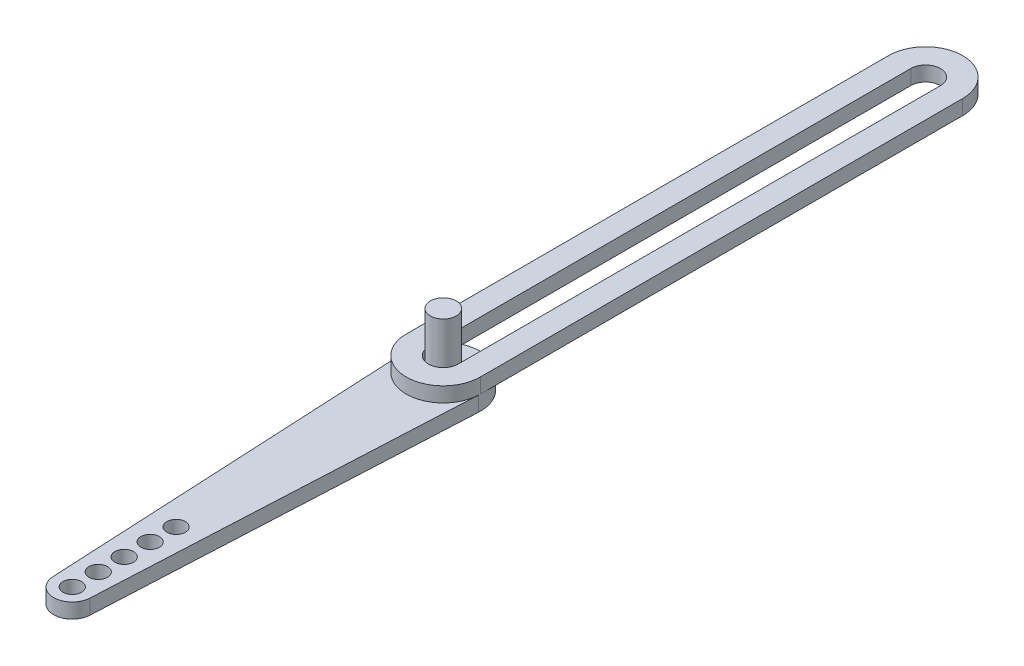
ISO-10303-21;
HEADER;
FILE_DESCRIPTION(('STEP AP214'),'2;1');
FILE_NAME('part.step','',(''),(''),'','','');
FILE_SCHEMA(('AUTOMOTIVE_DESIGN { 1 0 10303 214 1 1 1 1 }'));
ENDSEC;
DATA;
#1=APPLICATION_CONTEXT('core data for automotive mechanical design processes');
#2=APPLICATION_PROTOCOL_DEFINITION('international standard','automotive_design',2000,#1);
#3=PRODUCT_CONTEXT('',#1,'mechanical');
#4=PRODUCT('Part','Part','',(#3));
#5=PRODUCT_RELATED_PRODUCT_CATEGORY('part','',(#4));
#6=PRODUCT_DEFINITION_FORMATION('','',#4);
#7=PRODUCT_DEFINITION_CONTEXT('part definition',#1,'design');
#8=PRODUCT_DEFINITION('design','',#6,#7);
#9=PRODUCT_DEFINITION_SHAPE('','',#8);
#10=(LENGTH_UNIT() NAMED_UNIT(*) SI_UNIT(.MILLI.,.METRE.));
#11=(NAMED_UNIT(*) PLANE_ANGLE_UNIT() SI_UNIT($,.RADIAN.));
#12=(NAMED_UNIT(*) SI_UNIT($,.STERADIAN.) SOLID_ANGLE_UNIT());
#13=UNCERTAINTY_MEASURE_WITH_UNIT(LENGTH_MEASURE(1.E-05),#10,'distance_accuracy_value','');
#14=(GEOMETRIC_REPRESENTATION_CONTEXT(3) GLOBAL_UNCERTAINTY_ASSIGNED_CONTEXT((#13)) GLOBAL_UNIT_ASSIGNED_CONTEXT((#10,
#11,#12)) REPRESENTATION_CONTEXT('',''));
#15=CARTESIAN_POINT('',(0.,0.,0.));
#16=DIRECTION('',(0.,0.,1.));
#17=DIRECTION('',(1.,0.,0.));
#18=AXIS2_PLACEMENT_3D('',#15,#16,#17);
#19=CARTESIAN_POINT('',(0.,-15.,0.));
#20=DIRECTION('',(0.,-1.,0.));
#21=DIRECTION('',(0.,0.,-1.));
#22=AXIS2_PLACEMENT_3D('',#19,#20,#21);
#23=PLANE('',#22);
#24=CARTESIAN_POINT('',(0.,-15.,72.));
#25=DIRECTION('',(0.,-1.,0.));
#26=DIRECTION('',(0.,0.,-1.));
#27=AXIS2_PLACEMENT_3D('',#24,#25,#26);
#28=CIRCLE('',#27,2.5);
#29=CARTESIAN_POINT('',(0.,-15.,69.5));
#30=VERTEX_POINT('',#29);
#31=EDGE_CURVE('E214',#30,#30,#28,.T.);
#32=ORIENTED_EDGE('',*,*,#31,.T.);
#33=EDGE_LOOP('',(#32));
#34=FACE_BOUND('',#33,.T.);
#35=CARTESIAN_POINT('',(0.,-15.,79.));
#36=DIRECTION('',(0.,-1.,0.));
#37=DIRECTION('',(0.,0.,-1.));
#38=AXIS2_PLACEMENT_3D('',#35,#36,#37);
#39=CIRCLE('',#38,2.5);
#40=CARTESIAN_POINT('',(0.,-15.,76.5));
#41=VERTEX_POINT('',#40);
#42=EDGE_CURVE('E218',#41,#41,#39,.T.);
#43=ORIENTED_EDGE('',*,*,#42,.T.);
#44=EDGE_LOOP('',(#43));
#45=FACE_BOUND('',#44,.T.);
#46=CARTESIAN_POINT('',(0.,-15.,86.));
#47=DIRECTION('',(0.,-1.,0.));
#48=DIRECTION('',(0.,0.,-1.));
#49=AXIS2_PLACEMENT_3D('',#46,#47,#48);
#50=CIRCLE('',#49,2.5);
#51=CARTESIAN_POINT('',(0.,-15.,83.5));
#52=VERTEX_POINT('',#51);
#53=EDGE_CURVE('E222',#52,#52,#50,.T.);
#54=ORIENTED_EDGE('',*,*,#53,.T.);
#55=EDGE_LOOP('',(#54));
#56=FACE_BOUND('',#55,.T.);
#57=CARTESIAN_POINT('',(0.,-15.,93.));
#58=DIRECTION('',(0.,-1.,0.));
#59=DIRECTION('',(0.,0.,-1.));
#60=AXIS2_PLACEMENT_3D('',#57,#58,#59);
#61=CIRCLE('',#60,2.5);
#62=CARTESIAN_POINT('',(0.,-15.,90.5));
#63=VERTEX_POINT('',#62);
#64=EDGE_CURVE('E226',#63,#63,#61,.T.);
#65=ORIENTED_EDGE('',*,*,#64,.T.);
#66=EDGE_LOOP('',(#65));
#67=FACE_BOUND('',#66,.T.);
#68=CARTESIAN_POINT('',(0.,-15.,100.));
#69=DIRECTION('',(0.,-1.,0.));
#70=DIRECTION('',(0.,0.,-1.));
#71=AXIS2_PLACEMENT_3D('',#68,#69,#70);
#72=CIRCLE('',#71,2.5);
#73=CARTESIAN_POINT('',(0.,-15.,97.5));
#74=VERTEX_POINT('',#73);
#75=EDGE_CURVE('E230',#74,#74,#72,.T.);
#76=ORIENTED_EDGE('',*,*,#75,.T.);
#77=EDGE_LOOP('',(#76));
#78=FACE_BOUND('',#77,.T.);
#79=CARTESIAN_POINT('',(0.,-15.,0.));
#80=DIRECTION('',(0.,-1.,0.));
#81=DIRECTION('',(0.,0.,-1.));
#82=AXIS2_PLACEMENT_3D('',#79,#80,#81);
#83=CIRCLE('',#82,10.);
#84=CARTESIAN_POINT('',(-9.98749217771909,-15.,0.5));
#85=VERTEX_POINT('',#84);
#86=CARTESIAN_POINT('',(9.98749217771909,-15.,0.5));
#87=VERTEX_POINT('',#86);
#88=EDGE_CURVE('E11',#85,#87,#83,.F.);
#89=ORIENTED_EDGE('',*,*,#88,.F.);
#90=DIRECTION('',(-0.05,0.,-0.998749217771909));
#91=VECTOR('',#90,1.);
#92=CARTESIAN_POINT('',(-9.98749217771909,-15.,0.5));
#93=LINE('',#92,#91);
#94=CARTESIAN_POINT('',(-4.99374608885955,-15.,100.25));
#95=VERTEX_POINT('',#94);
#96=EDGE_CURVE('E233',#95,#85,#93,.T.);
#97=ORIENTED_EDGE('',*,*,#96,.F.);
#98=CARTESIAN_POINT('',(0.,-15.,100.));
#99=DIRECTION('',(0.,-1.,0.));
#100=DIRECTION('',(0.,0.,-1.));
#101=AXIS2_PLACEMENT_3D('',#98,#99,#100);
#102=CIRCLE('',#101,5.);
#103=CARTESIAN_POINT('',(4.99374608885955,-15.,100.25));
#104=VERTEX_POINT('',#103);
#105=EDGE_CURVE('E74',#104,#95,#102,.T.);
#106=ORIENTED_EDGE('',*,*,#105,.F.);
#107=DIRECTION('',(-0.05,0.,0.998749217771909));
#108=VECTOR('',#107,1.);
#109=CARTESIAN_POINT('',(9.98749217771909,-15.,0.5));
#110=LINE('',#109,#108);
#111=EDGE_CURVE('E244',#87,#104,#110,.T.);
#112=ORIENTED_EDGE('',*,*,#111,.F.);
#113=EDGE_LOOP('',(#89,#97,#106,#112));
#114=FACE_BOUND('',#113,.T.);
#115=ADVANCED_FACE('F34',(#34,#45,#56,#67,#78,#114),#23,.F.);
#116=CARTESIAN_POINT('',(0.,-15.,0.));
#117=DIRECTION('',(0.,1.,0.));
#118=DIRECTION('',(0.,0.,1.));
#119=AXIS2_PLACEMENT_3D('',#116,#117,#118);
#120=CYLINDRICAL_SURFACE('',#119,3.5);
#121=CARTESIAN_POINT('',(0.,-15.,0.));
#122=DIRECTION('',(0.,-1.,0.));
#123=DIRECTION('',(0.,0.,-1.));
#124=AXIS2_PLACEMENT_3D('',#121,#122,#123);
#125=CIRCLE('',#124,3.5);
#126=CARTESIAN_POINT('',(0.,-15.,-3.5));
#127=VERTEX_POINT('',#126);
#128=EDGE_CURVE('E257',#127,#127,#125,.F.);
#129=ORIENTED_EDGE('',*,*,#128,.T.);
#130=EDGE_LOOP('',(#129));
#131=FACE_BOUND('',#130,.T.);
#132=CARTESIAN_POINT('',(0.,0.,0.));
#133=DIRECTION('',(0.,1.,0.));
#134=DIRECTION('',(0.,0.,1.));
#135=AXIS2_PLACEMENT_3D('',#132,#133,#134);
#136=CIRCLE('',#135,3.5);
#137=CARTESIAN_POINT('',(0.,0.,3.5));
#138=VERTEX_POINT('',#137);
#139=EDGE_CURVE('E260',#138,#138,#136,.T.);
#140=ORIENTED_EDGE('',*,*,#139,.F.);
#141=EDGE_LOOP('',(#140));
#142=FACE_BOUND('',#141,.T.);
#143=ADVANCED_FACE('F36',(#131,#142),#120,.T.);
#144=CARTESIAN_POINT('',(0.,0.,0.));
#145=DIRECTION('',(0.,1.,0.));
#146=DIRECTION('',(0.,0.,1.));
#147=AXIS2_PLACEMENT_3D('',#144,#145,#146);
#148=PLANE('',#147);
#149=ORIENTED_EDGE('',*,*,#139,.T.);
#150=EDGE_LOOP('',(#149));
#151=FACE_BOUND('',#150,.T.);
#152=ADVANCED_FACE('F320',(#151),#148,.T.);
#153=CARTESIAN_POINT('',(0.,-19.,0.));
#154=DIRECTION('',(0.,1.,0.));
#155=DIRECTION('',(0.,0.,1.));
#156=AXIS2_PLACEMENT_3D('',#153,#154,#155);
#157=CYLINDRICAL_SURFACE('',#156,10.);
#158=DIRECTION('',(0.,-1.,0.));
#159=VECTOR('',#158,1.);
#160=CARTESIAN_POINT('',(-10.,-11.,0.));
#161=LINE('',#160,#159);
#162=CARTESIAN_POINT('',(-10.,-11.,0.));
#163=VERTEX_POINT('',#162);
#164=CARTESIAN_POINT('',(-10.,-15.,0.));
#165=VERTEX_POINT('',#164);
#166=EDGE_CURVE('E194',#163,#165,#161,.T.);
#167=ORIENTED_EDGE('',*,*,#166,.T.);
#168=CARTESIAN_POINT('',(0.,-15.,0.));
#169=DIRECTION('',(0.,-1.,0.));
#170=DIRECTION('',(0.,0.,-1.));
#171=AXIS2_PLACEMENT_3D('',#168,#169,#170);
#172=CIRCLE('',#171,10.);
#173=CARTESIAN_POINT('',(-4.,-15.,-9.16515138991168));
#174=VERTEX_POINT('',#173);
#175=EDGE_CURVE('E243',#165,#174,#172,.T.);
#176=ORIENTED_EDGE('',*,*,#175,.T.);
#177=CARTESIAN_POINT('',(4.,-15.,-9.16515138991168));
#178=VERTEX_POINT('',#177);
#179=EDGE_CURVE('E242',#174,#178,#172,.T.);
#180=ORIENTED_EDGE('',*,*,#179,.T.);
#181=CARTESIAN_POINT('',(10.,-15.,0.));
#182=VERTEX_POINT('',#181);
#183=EDGE_CURVE('E239',#178,#182,#172,.T.);
#184=ORIENTED_EDGE('',*,*,#183,.T.);
#185=DIRECTION('',(0.,-1.,0.));
#186=VECTOR('',#185,1.);
#187=CARTESIAN_POINT('',(10.,-11.,0.));
#188=LINE('',#187,#186);
#189=CARTESIAN_POINT('',(10.,-11.,0.));
#190=VERTEX_POINT('',#189);
#191=EDGE_CURVE('E208',#190,#182,#188,.T.);
#192=ORIENTED_EDGE('',*,*,#191,.F.);
#193=CARTESIAN_POINT('',(0.,-11.,0.));
#194=DIRECTION('',(0.,1.,0.));
#195=DIRECTION('',(0.,0.,1.));
#196=AXIS2_PLACEMENT_3D('',#193,#194,#195);
#197=CIRCLE('',#196,10.);
#198=EDGE_CURVE('E184',#163,#190,#197,.T.);
#199=ORIENTED_EDGE('',*,*,#198,.F.);
#200=EDGE_LOOP('',(#167,#176,#180,#184,#192,#199));
#201=FACE_BOUND('',#200,.T.);
#202=DIRECTION('',(0.,1.,0.));
#203=VECTOR('',#202,1.);
#204=CARTESIAN_POINT('',(-9.98749217771909,-19.,0.5));
#205=LINE('',#204,#203);
#206=CARTESIAN_POINT('',(-9.98749217771909,-19.,0.5));
#207=VERTEX_POINT('',#206);
#208=EDGE_CURVE('E238',#207,#85,#205,.T.);
#209=ORIENTED_EDGE('',*,*,#208,.T.);
#210=ORIENTED_EDGE('',*,*,#88,.T.);
#211=DIRECTION('',(0.,1.,0.));
#212=VECTOR('',#211,1.);
#213=CARTESIAN_POINT('',(9.98749217771909,-19.,0.5));
#214=LINE('',#213,#212);
#215=CARTESIAN_POINT('',(9.98749217771909,-19.,0.5));
#216=VERTEX_POINT('',#215);
#217=EDGE_CURVE('E255',#216,#87,#214,.T.);
#218=ORIENTED_EDGE('',*,*,#217,.F.);
#219=CARTESIAN_POINT('',(0.,-19.,0.));
#220=DIRECTION('',(0.,-1.,0.));
#221=DIRECTION('',(0.,0.,-1.));
#222=AXIS2_PLACEMENT_3D('',#219,#220,#221);
#223=CIRCLE('',#222,10.);
#224=EDGE_CURVE('E231',#207,#216,#223,.T.);
#225=ORIENTED_EDGE('',*,*,#224,.F.);
#226=EDGE_LOOP('',(#209,#210,#218,#225));
#227=FACE_BOUND('',#226,.T.);
#228=ADVANCED_FACE('F287',(#201,#227),#157,.T.);
#229=CARTESIAN_POINT('',(9.98749217771909,-19.,0.5));
#230=DIRECTION('',(-0.998749217771909,0.,-0.05));
#231=DIRECTION('',(-0.05,0.,0.998749217771909));
#232=AXIS2_PLACEMENT_3D('',#229,#230,#231);
#233=PLANE('',#232);
#234=ORIENTED_EDGE('',*,*,#111,.T.);
#235=DIRECTION('',(0.,1.,0.));
#236=VECTOR('',#235,1.);
#237=CARTESIAN_POINT('',(4.99374608885955,-19.,100.25));
#238=LINE('',#237,#236);
#239=CARTESIAN_POINT('',(4.99374608885955,-19.,100.25));
#240=VERTEX_POINT('',#239);
#241=EDGE_CURVE('E253',#240,#104,#238,.T.);
#242=ORIENTED_EDGE('',*,*,#241,.F.);
#243=DIRECTION('',(-0.05,0.,0.998749217771909));
#244=VECTOR('',#243,1.);
#245=CARTESIAN_POINT('',(9.98749217771909,-19.,0.5));
#246=LINE('',#245,#244);
#247=EDGE_CURVE('E82',#216,#240,#246,.T.);
#248=ORIENTED_EDGE('',*,*,#247,.F.);
#249=ORIENTED_EDGE('',*,*,#217,.T.);
#250=EDGE_LOOP('',(#234,#242,#248,#249));
#251=FACE_BOUND('',#250,.T.);
#252=ADVANCED_FACE('F346',(#251),#233,.F.);
#253=CARTESIAN_POINT('',(0.,-19.,100.));
#254=DIRECTION('',(0.,1.,0.));
#255=DIRECTION('',(0.,0.,1.));
#256=AXIS2_PLACEMENT_3D('',#253,#254,#255);
#257=CYLINDRICAL_SURFACE('',#256,5.);
#258=ORIENTED_EDGE('',*,*,#105,.T.);
#259=DIRECTION('',(0.,1.,0.));
#260=VECTOR('',#259,1.);
#261=CARTESIAN_POINT('',(-4.99374608885955,-19.,100.25));
#262=LINE('',#261,#260);
#263=CARTESIAN_POINT('',(-4.99374608885955,-19.,100.25));
#264=VERTEX_POINT('',#263);
#265=EDGE_CURVE('E251',#264,#95,#262,.T.);
#266=ORIENTED_EDGE('',*,*,#265,.F.);
#267=CARTESIAN_POINT('',(0.,-19.,100.));
#268=DIRECTION('',(0.,-1.,0.));
#269=DIRECTION('',(0.,0.,-1.));
#270=AXIS2_PLACEMENT_3D('',#267,#268,#269);
#271=CIRCLE('',#270,5.);
#272=EDGE_CURVE('E235',#240,#264,#271,.T.);
#273=ORIENTED_EDGE('',*,*,#272,.F.);
#274=ORIENTED_EDGE('',*,*,#241,.T.);
#275=EDGE_LOOP('',(#258,#266,#273,#274));
#276=FACE_BOUND('',#275,.T.);
#277=ADVANCED_FACE('F351',(#276),#257,.T.);
#278=CARTESIAN_POINT('',(-9.98749217771909,-19.,0.5));
#279=DIRECTION('',(0.998749217771909,0.,-0.05));
#280=DIRECTION('',(-0.05,0.,-0.998749217771909));
#281=AXIS2_PLACEMENT_3D('',#278,#279,#280);
#282=PLANE('',#281);
#283=ORIENTED_EDGE('',*,*,#96,.T.);
#284=ORIENTED_EDGE('',*,*,#208,.F.);
#285=DIRECTION('',(-0.05,0.,-0.998749217771909));
#286=VECTOR('',#285,1.);
#287=CARTESIAN_POINT('',(-9.98749217771909,-19.,0.5));
#288=LINE('',#287,#286);
#289=EDGE_CURVE('E58',#264,#207,#288,.T.);
#290=ORIENTED_EDGE('',*,*,#289,.F.);
#291=ORIENTED_EDGE('',*,*,#265,.T.);
#292=EDGE_LOOP('',(#283,#284,#290,#291));
#293=FACE_BOUND('',#292,.T.);
#294=ADVANCED_FACE('F336',(#293),#282,.F.);
#295=CARTESIAN_POINT('',(0.,-19.,0.));
#296=DIRECTION('',(0.,-1.,0.));
#297=DIRECTION('',(0.,0.,-1.));
#298=AXIS2_PLACEMENT_3D('',#295,#296,#297);
#299=PLANE('',#298);
#300=CARTESIAN_POINT('',(0.,-19.,0.));
#301=DIRECTION('',(0.,-1.,0.));
#302=DIRECTION('',(0.,0.,-1.));
#303=AXIS2_PLACEMENT_3D('',#300,#301,#302);
#304=CIRCLE('',#303,6.5);
#305=CARTESIAN_POINT('',(0.,-19.,-6.5));
#306=VERTEX_POINT('',#305);
#307=EDGE_CURVE('E584',#306,#306,#304,.T.);
#308=ORIENTED_EDGE('',*,*,#307,.F.);
#309=EDGE_LOOP('',(#308));
#310=FACE_BOUND('',#309,.T.);
#311=CARTESIAN_POINT('',(0.,-19.,72.));
#312=DIRECTION('',(0.,-1.,0.));
#313=DIRECTION('',(0.,0.,-1.));
#314=AXIS2_PLACEMENT_3D('',#311,#312,#313);
#315=CIRCLE('',#314,2.5);
#316=CARTESIAN_POINT('',(0.,-19.,69.5));
#317=VERTEX_POINT('',#316);
#318=EDGE_CURVE('E211',#317,#317,#315,.T.);
#319=ORIENTED_EDGE('',*,*,#318,.F.);
#320=EDGE_LOOP('',(#319));
#321=FACE_BOUND('',#320,.T.);
#322=CARTESIAN_POINT('',(0.,-19.,79.));
#323=DIRECTION('',(0.,-1.,0.));
#324=DIRECTION('',(0.,0.,-1.));
#325=AXIS2_PLACEMENT_3D('',#322,#323,#324);
#326=CIRCLE('',#325,2.5);
#327=CARTESIAN_POINT('',(0.,-19.,76.5));
#328=VERTEX_POINT('',#327);
#329=EDGE_CURVE('E215',#328,#328,#326,.T.);
#330=ORIENTED_EDGE('',*,*,#329,.F.);
#331=EDGE_LOOP('',(#330));
#332=FACE_BOUND('',#331,.T.);
#333=CARTESIAN_POINT('',(0.,-19.,86.));
#334=DIRECTION('',(0.,-1.,0.));
#335=DIRECTION('',(0.,0.,-1.));
#336=AXIS2_PLACEMENT_3D('',#333,#334,#335);
#337=CIRCLE('',#336,2.5);
#338=CARTESIAN_POINT('',(0.,-19.,83.5));
#339=VERTEX_POINT('',#338);
#340=EDGE_CURVE('E219',#339,#339,#337,.T.);
#341=ORIENTED_EDGE('',*,*,#340,.F.);
#342=EDGE_LOOP('',(#341));
#343=FACE_BOUND('',#342,.T.);
#344=CARTESIAN_POINT('',(0.,-19.,93.));
#345=DIRECTION('',(0.,-1.,0.));
#346=DIRECTION('',(0.,0.,-1.));
#347=AXIS2_PLACEMENT_3D('',#344,#345,#346);
#348=CIRCLE('',#347,2.5);
#349=CARTESIAN_POINT('',(0.,-19.,90.5));
#350=VERTEX_POINT('',#349);
#351=EDGE_CURVE('E223',#350,#350,#348,.T.);
#352=ORIENTED_EDGE('',*,*,#351,.F.);
#353=EDGE_LOOP('',(#352));
#354=FACE_BOUND('',#353,.T.);
#355=CARTESIAN_POINT('',(0.,-19.,100.));
#356=DIRECTION('',(0.,-1.,0.));
#357=DIRECTION('',(0.,0.,-1.));
#358=AXIS2_PLACEMENT_3D('',#355,#356,#357);
#359=CIRCLE('',#358,2.5);
#360=CARTESIAN_POINT('',(0.,-19.,97.5));
#361=VERTEX_POINT('',#360);
#362=EDGE_CURVE('E227',#361,#361,#359,.T.);
#363=ORIENTED_EDGE('',*,*,#362,.F.);
#364=EDGE_LOOP('',(#363));
#365=FACE_BOUND('',#364,.T.);
#366=ORIENTED_EDGE('',*,*,#224,.T.);
#367=ORIENTED_EDGE('',*,*,#247,.T.);
#368=ORIENTED_EDGE('',*,*,#272,.T.);
#369=ORIENTED_EDGE('',*,*,#289,.T.);
#370=EDGE_LOOP('',(#366,#367,#368,#369));
#371=FACE_BOUND('',#370,.T.);
#372=ADVANCED_FACE('F327',(#310,#321,#332,#343,#354,#365,#371),#299,.T.);
#373=ORIENTED_EDGE('',*,*,#128,.F.);
#374=EDGE_LOOP('',(#373));
#375=FACE_BOUND('',#374,.T.);
#376=CARTESIAN_POINT('',(0.,-15.,0.));
#377=DIRECTION('',(0.,1.,0.));
#378=DIRECTION('',(0.,0.,1.));
#379=AXIS2_PLACEMENT_3D('',#376,#377,#378);
#380=CIRCLE('',#379,4.);
#381=CARTESIAN_POINT('',(-4.,-15.,0.));
#382=VERTEX_POINT('',#381);
#383=CARTESIAN_POINT('',(4.,-15.,0.));
#384=VERTEX_POINT('',#383);
#385=EDGE_CURVE('E170',#382,#384,#380,.T.);
#386=ORIENTED_EDGE('',*,*,#385,.T.);
#387=DIRECTION('',(0.,0.,-1.));
#388=VECTOR('',#387,1.);
#389=CARTESIAN_POINT('',(4.,-15.,0.));
#390=LINE('',#389,#388);
#391=EDGE_CURVE('E156',#384,#178,#390,.T.);
#392=ORIENTED_EDGE('',*,*,#391,.T.);
#393=ORIENTED_EDGE('',*,*,#179,.F.);
#394=DIRECTION('',(0.,0.,1.));
#395=VECTOR('',#394,1.);
#396=CARTESIAN_POINT('',(-4.,-15.,0.));
#397=LINE('',#396,#395);
#398=EDGE_CURVE('E42',#174,#382,#397,.T.);
#399=ORIENTED_EDGE('',*,*,#398,.T.);
#400=EDGE_LOOP('',(#386,#392,#393,#399));
#401=FACE_BOUND('',#400,.T.);
#402=ADVANCED_FACE('F275',(#375,#401),#23,.F.);
#403=CARTESIAN_POINT('',(0.,0.,100.));
#404=DIRECTION('',(0.,-1.,0.));
#405=DIRECTION('',(0.,0.,-1.));
#406=AXIS2_PLACEMENT_3D('',#403,#404,#405);
#407=CYLINDRICAL_SURFACE('',#406,2.5);
#408=ORIENTED_EDGE('',*,*,#362,.T.);
#409=EDGE_LOOP('',(#408));
#410=FACE_BOUND('',#409,.T.);
#411=ORIENTED_EDGE('',*,*,#75,.F.);
#412=EDGE_LOOP('',(#411));
#413=FACE_BOUND('',#412,.T.);
#414=ADVANCED_FACE('F326',(#410,#413),#407,.F.);
#415=CARTESIAN_POINT('',(0.,0.,93.));
#416=DIRECTION('',(0.,-1.,0.));
#417=DIRECTION('',(0.,0.,-1.));
#418=AXIS2_PLACEMENT_3D('',#415,#416,#417);
#419=CYLINDRICAL_SURFACE('',#418,2.5);
#420=ORIENTED_EDGE('',*,*,#351,.T.);
#421=EDGE_LOOP('',(#420));
#422=FACE_BOUND('',#421,.T.);
#423=ORIENTED_EDGE('',*,*,#64,.F.);
#424=EDGE_LOOP('',(#423));
#425=FACE_BOUND('',#424,.T.);
#426=ADVANCED_FACE('F333',(#422,#425),#419,.F.);
#427=CARTESIAN_POINT('',(0.,0.,86.));
#428=DIRECTION('',(0.,-1.,0.));
#429=DIRECTION('',(0.,0.,-1.));
#430=AXIS2_PLACEMENT_3D('',#427,#428,#429);
#431=CYLINDRICAL_SURFACE('',#430,2.5);
#432=ORIENTED_EDGE('',*,*,#340,.T.);
#433=EDGE_LOOP('',(#432));
#434=FACE_BOUND('',#433,.T.);
#435=ORIENTED_EDGE('',*,*,#53,.F.);
#436=EDGE_LOOP('',(#435));
#437=FACE_BOUND('',#436,.T.);
#438=ADVANCED_FACE('F423',(#434,#437),#431,.F.);
#439=CARTESIAN_POINT('',(0.,0.,79.));
#440=DIRECTION('',(0.,-1.,0.));
#441=DIRECTION('',(0.,0.,-1.));
#442=AXIS2_PLACEMENT_3D('',#439,#440,#441);
#443=CYLINDRICAL_SURFACE('',#442,2.5);
#444=ORIENTED_EDGE('',*,*,#329,.T.);
#445=EDGE_LOOP('',(#444));
#446=FACE_BOUND('',#445,.T.);
#447=ORIENTED_EDGE('',*,*,#42,.F.);
#448=EDGE_LOOP('',(#447));
#449=FACE_BOUND('',#448,.T.);
#450=ADVANCED_FACE('F419',(#446,#449),#443,.F.);
#451=CARTESIAN_POINT('',(0.,0.,72.));
#452=DIRECTION('',(0.,-1.,0.));
#453=DIRECTION('',(0.,0.,-1.));
#454=AXIS2_PLACEMENT_3D('',#451,#452,#453);
#455=CYLINDRICAL_SURFACE('',#454,2.5);
#456=ORIENTED_EDGE('',*,*,#318,.T.);
#457=EDGE_LOOP('',(#456));
#458=FACE_BOUND('',#457,.T.);
#459=ORIENTED_EDGE('',*,*,#31,.F.);
#460=EDGE_LOOP('',(#459));
#461=FACE_BOUND('',#460,.T.);
#462=ADVANCED_FACE('F311',(#458,#461),#455,.F.);
#463=CARTESIAN_POINT('',(0.,-15.,0.));
#464=DIRECTION('',(0.,1.,0.));
#465=DIRECTION('',(0.,0.,1.));
#466=AXIS2_PLACEMENT_3D('',#463,#464,#465);
#467=PLANE('',#466);
#468=DIRECTION('',(0.,0.,-1.));
#469=VECTOR('',#468,1.);
#470=CARTESIAN_POINT('',(10.,-15.,0.));
#471=LINE('',#470,#469);
#472=CARTESIAN_POINT('',(10.,-15.,-130.));
#473=VERTEX_POINT('',#472);
#474=EDGE_CURVE('E157',#182,#473,#471,.T.);
#475=ORIENTED_EDGE('',*,*,#474,.F.);
#476=ORIENTED_EDGE('',*,*,#183,.F.);
#477=CARTESIAN_POINT('',(4.,-15.,-130.));
#478=VERTEX_POINT('',#477);
#479=EDGE_CURVE('E172',#178,#478,#390,.T.);
#480=ORIENTED_EDGE('',*,*,#479,.T.);
#481=CARTESIAN_POINT('',(0.,-15.,-130.));
#482=DIRECTION('',(0.,1.,0.));
#483=DIRECTION('',(0.,0.,1.));
#484=AXIS2_PLACEMENT_3D('',#481,#482,#483);
#485=CIRCLE('',#484,4.);
#486=CARTESIAN_POINT('',(-4.,-15.,-130.));
#487=VERTEX_POINT('',#486);
#488=EDGE_CURVE('E175',#478,#487,#485,.T.);
#489=ORIENTED_EDGE('',*,*,#488,.T.);
#490=DIRECTION('',(0.,0.,1.));
#491=VECTOR('',#490,1.);
#492=CARTESIAN_POINT('',(-4.,-15.,0.));
#493=LINE('',#492,#491);
#494=EDGE_CURVE('E148',#487,#174,#493,.T.);
#495=ORIENTED_EDGE('',*,*,#494,.T.);
#496=ORIENTED_EDGE('',*,*,#175,.F.);
#497=DIRECTION('',(0.,0.,1.));
#498=VECTOR('',#497,1.);
#499=CARTESIAN_POINT('',(-10.,-15.,0.));
#500=LINE('',#499,#498);
#501=CARTESIAN_POINT('',(-10.,-15.,-130.));
#502=VERTEX_POINT('',#501);
#503=EDGE_CURVE('E188',#502,#165,#500,.T.);
#504=ORIENTED_EDGE('',*,*,#503,.F.);
#505=CARTESIAN_POINT('',(0.,-15.,-130.));
#506=DIRECTION('',(0.,1.,0.));
#507=DIRECTION('',(0.,0.,1.));
#508=AXIS2_PLACEMENT_3D('',#505,#506,#507);
#509=CIRCLE('',#508,10.);
#510=EDGE_CURVE('E196',#473,#502,#509,.T.);
#511=ORIENTED_EDGE('',*,*,#510,.F.);
#512=EDGE_LOOP('',(#475,#476,#480,#489,#495,#496,#504,#511));
#513=FACE_BOUND('',#512,.T.);
#514=ADVANCED_FACE('F281',(#513),#467,.F.);
#515=CARTESIAN_POINT('',(0.,-11.,0.));
#516=DIRECTION('',(0.,1.,0.));
#517=DIRECTION('',(0.,0.,1.));
#518=AXIS2_PLACEMENT_3D('',#515,#516,#517);
#519=PLANE('',#518);
#520=ORIENTED_EDGE('',*,*,#198,.T.);
#521=DIRECTION('',(0.,0.,-1.));
#522=VECTOR('',#521,1.);
#523=CARTESIAN_POINT('',(10.,-11.,0.));
#524=LINE('',#523,#522);
#525=CARTESIAN_POINT('',(10.,-11.,-130.));
#526=VERTEX_POINT('',#525);
#527=EDGE_CURVE('E187',#190,#526,#524,.T.);
#528=ORIENTED_EDGE('',*,*,#527,.T.);
#529=CARTESIAN_POINT('',(0.,-11.,-130.));
#530=DIRECTION('',(0.,1.,0.));
#531=DIRECTION('',(0.,0.,1.));
#532=AXIS2_PLACEMENT_3D('',#529,#530,#531);
#533=CIRCLE('',#532,10.);
#534=CARTESIAN_POINT('',(-10.,-11.,-130.));
#535=VERTEX_POINT('',#534);
#536=EDGE_CURVE('E190',#526,#535,#533,.T.);
#537=ORIENTED_EDGE('',*,*,#536,.T.);
#538=DIRECTION('',(0.,0.,1.));
#539=VECTOR('',#538,1.);
#540=CARTESIAN_POINT('',(-10.,-11.,0.));
#541=LINE('',#540,#539);
#542=EDGE_CURVE('E192',#535,#163,#541,.T.);
#543=ORIENTED_EDGE('',*,*,#542,.T.);
#544=EDGE_LOOP('',(#520,#528,#537,#543));
#545=FACE_BOUND('',#544,.T.);
#546=DIRECTION('',(0.,0.,-1.));
#547=VECTOR('',#546,1.);
#548=CARTESIAN_POINT('',(4.,-11.,0.));
#549=LINE('',#548,#547);
#550=CARTESIAN_POINT('',(4.,-11.,0.));
#551=VERTEX_POINT('',#550);
#552=CARTESIAN_POINT('',(4.,-11.,-130.));
#553=VERTEX_POINT('',#552);
#554=EDGE_CURVE('E147',#551,#553,#549,.T.);
#555=ORIENTED_EDGE('',*,*,#554,.F.);
#556=CARTESIAN_POINT('',(0.,-11.,0.));
#557=DIRECTION('',(0.,1.,0.));
#558=DIRECTION('',(0.,0.,1.));
#559=AXIS2_PLACEMENT_3D('',#556,#557,#558);
#560=CIRCLE('',#559,4.);
#561=CARTESIAN_POINT('',(-4.,-11.,0.));
#562=VERTEX_POINT('',#561);
#563=EDGE_CURVE('E139',#562,#551,#560,.T.);
#564=ORIENTED_EDGE('',*,*,#563,.F.);
#565=DIRECTION('',(0.,0.,1.));
#566=VECTOR('',#565,1.);
#567=CARTESIAN_POINT('',(-4.,-11.,0.));
#568=LINE('',#567,#566);
#569=CARTESIAN_POINT('',(-4.,-11.,-130.));
#570=VERTEX_POINT('',#569);
#571=EDGE_CURVE('E165',#570,#562,#568,.T.);
#572=ORIENTED_EDGE('',*,*,#571,.F.);
#573=CARTESIAN_POINT('',(0.,-11.,-130.));
#574=DIRECTION('',(0.,1.,0.));
#575=DIRECTION('',(0.,0.,1.));
#576=AXIS2_PLACEMENT_3D('',#573,#574,#575);
#577=CIRCLE('',#576,4.);
#578=EDGE_CURVE('E163',#553,#570,#577,.T.);
#579=ORIENTED_EDGE('',*,*,#578,.F.);
#580=EDGE_LOOP('',(#555,#564,#572,#579));
#581=FACE_BOUND('',#580,.T.);
#582=ADVANCED_FACE('F161',(#545,#581),#519,.T.);
#583=CARTESIAN_POINT('',(10.,-11.,0.));
#584=DIRECTION('',(-1.,0.,0.));
#585=DIRECTION('',(0.,0.,1.));
#586=AXIS2_PLACEMENT_3D('',#583,#584,#585);
#587=PLANE('',#586);
#588=ORIENTED_EDGE('',*,*,#474,.T.);
#589=DIRECTION('',(0.,-1.,0.));
#590=VECTOR('',#589,1.);
#591=CARTESIAN_POINT('',(10.,-11.,-130.));
#592=LINE('',#591,#590);
#593=EDGE_CURVE('E205',#526,#473,#592,.T.);
#594=ORIENTED_EDGE('',*,*,#593,.F.);
#595=ORIENTED_EDGE('',*,*,#527,.F.);
#596=ORIENTED_EDGE('',*,*,#191,.T.);
#597=EDGE_LOOP('',(#588,#594,#595,#596));
#598=FACE_BOUND('',#597,.T.);
#599=ADVANCED_FACE('F302',(#598),#587,.F.);
#600=CARTESIAN_POINT('',(0.,-11.,-130.));
#601=DIRECTION('',(0.,-1.,0.));
#602=DIRECTION('',(0.,0.,-1.));
#603=AXIS2_PLACEMENT_3D('',#600,#601,#602);
#604=CYLINDRICAL_SURFACE('',#603,10.);
#605=ORIENTED_EDGE('',*,*,#510,.T.);
#606=DIRECTION('',(0.,-1.,0.));
#607=VECTOR('',#606,1.);
#608=CARTESIAN_POINT('',(-10.,-11.,-130.));
#609=LINE('',#608,#607);
#610=EDGE_CURVE('E202',#535,#502,#609,.T.);
#611=ORIENTED_EDGE('',*,*,#610,.F.);
#612=ORIENTED_EDGE('',*,*,#536,.F.);
#613=ORIENTED_EDGE('',*,*,#593,.T.);
#614=EDGE_LOOP('',(#605,#611,#612,#613));
#615=FACE_BOUND('',#614,.T.);
#616=ADVANCED_FACE('F298',(#615),#604,.T.);
#617=CARTESIAN_POINT('',(-10.,-11.,0.));
#618=DIRECTION('',(1.,0.,0.));
#619=DIRECTION('',(0.,0.,-1.));
#620=AXIS2_PLACEMENT_3D('',#617,#618,#619);
#621=PLANE('',#620);
#622=ORIENTED_EDGE('',*,*,#503,.T.);
#623=ORIENTED_EDGE('',*,*,#166,.F.);
#624=ORIENTED_EDGE('',*,*,#542,.F.);
#625=ORIENTED_EDGE('',*,*,#610,.T.);
#626=EDGE_LOOP('',(#622,#623,#624,#625));
#627=FACE_BOUND('',#626,.T.);
#628=ADVANCED_FACE('F294',(#627),#621,.F.);
#629=CARTESIAN_POINT('',(0.,-11.,0.));
#630=DIRECTION('',(0.,-1.,0.));
#631=DIRECTION('',(0.,0.,-1.));
#632=AXIS2_PLACEMENT_3D('',#629,#630,#631);
#633=CYLINDRICAL_SURFACE('',#632,4.);
#634=ORIENTED_EDGE('',*,*,#385,.F.);
#635=DIRECTION('',(0.,-1.,0.));
#636=VECTOR('',#635,1.);
#637=CARTESIAN_POINT('',(-4.,-11.,0.));
#638=LINE('',#637,#636);
#639=EDGE_CURVE('E49',#562,#382,#638,.T.);
#640=ORIENTED_EDGE('',*,*,#639,.F.);
#641=ORIENTED_EDGE('',*,*,#563,.T.);
#642=DIRECTION('',(0.,-1.,0.));
#643=VECTOR('',#642,1.);
#644=CARTESIAN_POINT('',(4.,-11.,0.));
#645=LINE('',#644,#643);
#646=EDGE_CURVE('E142',#551,#384,#645,.T.);
#647=ORIENTED_EDGE('',*,*,#646,.T.);
#648=EDGE_LOOP('',(#634,#640,#641,#647));
#649=FACE_BOUND('',#648,.T.);
#650=ADVANCED_FACE('F141',(#649),#633,.F.);
#651=CARTESIAN_POINT('',(4.,-11.,0.));
#652=DIRECTION('',(-1.,0.,0.));
#653=DIRECTION('',(0.,0.,1.));
#654=AXIS2_PLACEMENT_3D('',#651,#652,#653);
#655=PLANE('',#654);
#656=ORIENTED_EDGE('',*,*,#391,.F.);
#657=ORIENTED_EDGE('',*,*,#646,.F.);
#658=ORIENTED_EDGE('',*,*,#554,.T.);
#659=DIRECTION('',(0.,-1.,0.));
#660=VECTOR('',#659,1.);
#661=CARTESIAN_POINT('',(4.,-11.,-130.));
#662=LINE('',#661,#660);
#663=EDGE_CURVE('E158',#553,#478,#662,.T.);
#664=ORIENTED_EDGE('',*,*,#663,.T.);
#665=ORIENTED_EDGE('',*,*,#479,.F.);
#666=EDGE_LOOP('',(#656,#657,#658,#664,#665));
#667=FACE_BOUND('',#666,.T.);
#668=ADVANCED_FACE('F151',(#667),#655,.T.);
#669=CARTESIAN_POINT('',(0.,-11.,-130.));
#670=DIRECTION('',(0.,-1.,0.));
#671=DIRECTION('',(0.,0.,-1.));
#672=AXIS2_PLACEMENT_3D('',#669,#670,#671);
#673=CYLINDRICAL_SURFACE('',#672,4.);
#674=ORIENTED_EDGE('',*,*,#488,.F.);
#675=ORIENTED_EDGE('',*,*,#663,.F.);
#676=ORIENTED_EDGE('',*,*,#578,.T.);
#677=DIRECTION('',(0.,-1.,0.));
#678=VECTOR('',#677,1.);
#679=CARTESIAN_POINT('',(-4.,-11.,-130.));
#680=LINE('',#679,#678);
#681=EDGE_CURVE('E181',#570,#487,#680,.T.);
#682=ORIENTED_EDGE('',*,*,#681,.T.);
#683=EDGE_LOOP('',(#674,#675,#676,#682));
#684=FACE_BOUND('',#683,.T.);
#685=ADVANCED_FACE('F285',(#684),#673,.F.);
#686=CARTESIAN_POINT('',(-4.,-11.,0.));
#687=DIRECTION('',(1.,0.,0.));
#688=DIRECTION('',(0.,0.,-1.));
#689=AXIS2_PLACEMENT_3D('',#686,#687,#688);
#690=PLANE('',#689);
#691=ORIENTED_EDGE('',*,*,#494,.F.);
#692=ORIENTED_EDGE('',*,*,#681,.F.);
#693=ORIENTED_EDGE('',*,*,#571,.T.);
#694=ORIENTED_EDGE('',*,*,#639,.T.);
#695=ORIENTED_EDGE('',*,*,#398,.F.);
#696=EDGE_LOOP('',(#691,#692,#693,#694,#695));
#697=FACE_BOUND('',#696,.T.);
#698=ADVANCED_FACE('F279',(#697),#690,.T.);
#699=CARTESIAN_POINT('',(0.,-21.,0.));
#700=DIRECTION('',(0.,1.,0.));
#701=DIRECTION('',(0.,0.,1.));
#702=AXIS2_PLACEMENT_3D('',#699,#700,#701);
#703=CYLINDRICAL_SURFACE('',#702,6.5);
#704=CARTESIAN_POINT('',(0.,-21.,0.));
#705=DIRECTION('',(0.,-1.,0.));
#706=DIRECTION('',(0.,0.,-1.));
#707=AXIS2_PLACEMENT_3D('',#704,#705,#706);
#708=CIRCLE('',#707,6.5);
#709=CARTESIAN_POINT('',(0.,-21.,-6.5));
#710=VERTEX_POINT('',#709);
#711=EDGE_CURVE('E173',#710,#710,#708,.T.);
#712=ORIENTED_EDGE('',*,*,#711,.F.);
#713=EDGE_LOOP('',(#712));
#714=FACE_BOUND('',#713,.T.);
#715=ORIENTED_EDGE('',*,*,#307,.T.);
#716=EDGE_LOOP('',(#715));
#717=FACE_BOUND('',#716,.T.);
#718=ADVANCED_FACE('F382',(#714,#717),#703,.T.);
#719=CARTESIAN_POINT('',(0.,-21.,0.));
#720=DIRECTION('',(0.,-1.,0.));
#721=DIRECTION('',(0.,0.,-1.));
#722=AXIS2_PLACEMENT_3D('',#719,#720,#721);
#723=PLANE('',#722);
#724=ORIENTED_EDGE('',*,*,#711,.T.);
#725=EDGE_LOOP('',(#724));
#726=FACE_BOUND('',#725,.T.);
#727=ADVANCED_FACE('F387',(#726),#723,.T.);
#728=CLOSED_SHELL('',(#115,#143,#152,#228,#252,#277,#294,#372,#402,#414,#426,#438,#450,#462,
#514,#582,#599,#616,#628,#650,#668,#685,#698,#718,#727));
#729=MANIFOLD_SOLID_BREP('B2',#728);
#730=ADVANCED_BREP_SHAPE_REPRESENTATION('',(#18,#729),#14);
#731=SHAPE_DEFINITION_REPRESENTATION(#9,#730);
ENDSEC;
END-ISO-10303-21;
